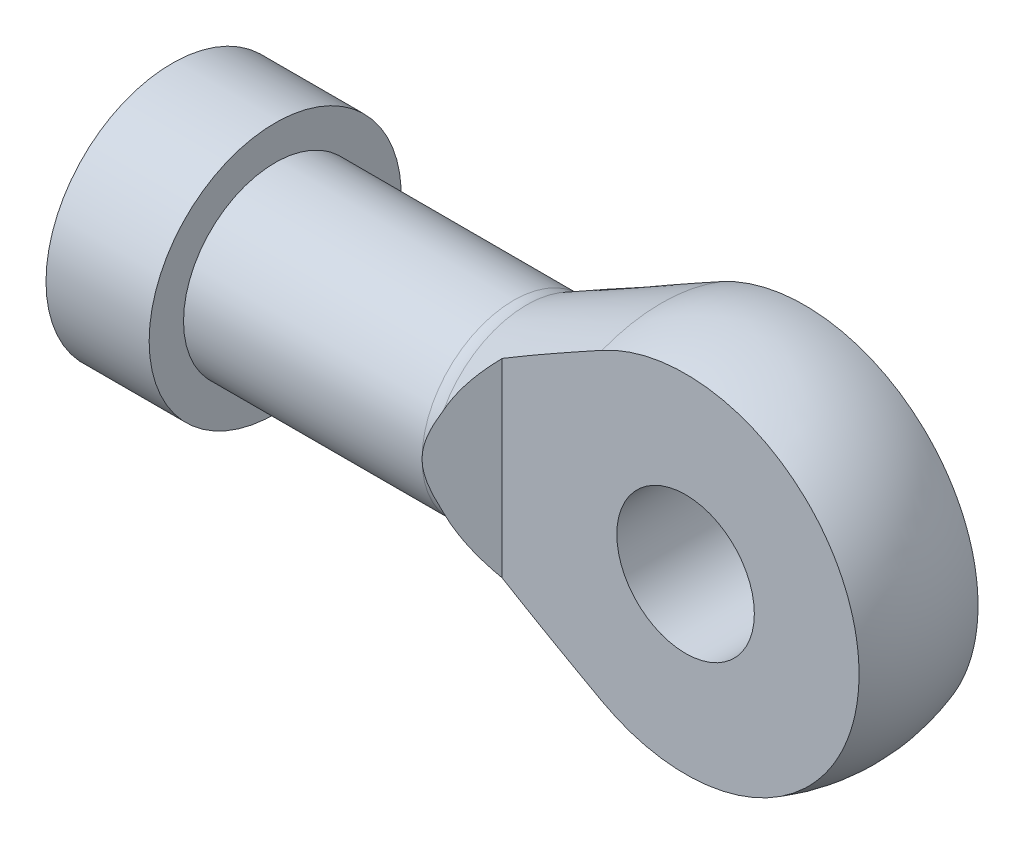
ISO-10303-21;
HEADER;
FILE_DESCRIPTION(('STEP AP214'),'2;1');
FILE_NAME('part.step','',(''),(''),'','','');
FILE_SCHEMA(('AUTOMOTIVE_DESIGN { 1 0 10303 214 1 1 1 1 }'));
ENDSEC;
DATA;
#1=APPLICATION_CONTEXT('core data for automotive mechanical design processes');
#2=APPLICATION_PROTOCOL_DEFINITION('international standard','automotive_design',2000,#1);
#3=PRODUCT_CONTEXT('',#1,'mechanical');
#4=PRODUCT('Part','Part','',(#3));
#5=PRODUCT_RELATED_PRODUCT_CATEGORY('part','',(#4));
#6=PRODUCT_DEFINITION_FORMATION('','',#4);
#7=PRODUCT_DEFINITION_CONTEXT('part definition',#1,'design');
#8=PRODUCT_DEFINITION('design','',#6,#7);
#9=PRODUCT_DEFINITION_SHAPE('','',#8);
#10=(LENGTH_UNIT() NAMED_UNIT(*) SI_UNIT(.MILLI.,.METRE.));
#11=(NAMED_UNIT(*) PLANE_ANGLE_UNIT() SI_UNIT($,.RADIAN.));
#12=(NAMED_UNIT(*) SI_UNIT($,.STERADIAN.) SOLID_ANGLE_UNIT());
#13=UNCERTAINTY_MEASURE_WITH_UNIT(LENGTH_MEASURE(1.E-05),#10,'distance_accuracy_value','');
#14=(GEOMETRIC_REPRESENTATION_CONTEXT(3) GLOBAL_UNCERTAINTY_ASSIGNED_CONTEXT((#13)) GLOBAL_UNIT_ASSIGNED_CONTEXT((#10,
#11,#12)) REPRESENTATION_CONTEXT('',''));
#15=CARTESIAN_POINT('',(0.,0.,0.));
#16=DIRECTION('',(0.,0.,1.));
#17=DIRECTION('',(1.,0.,0.));
#18=AXIS2_PLACEMENT_3D('',#15,#16,#17);
#19=CARTESIAN_POINT('',(29.8113288265605,0.,0.));
#20=DIRECTION('',(-1.,0.,0.));
#21=DIRECTION('',(0.,0.,1.));
#22=AXIS2_PLACEMENT_3D('',#19,#20,#21);
#23=TOROIDAL_SURFACE('',#22,11.,3.00000000000001);
#24=CARTESIAN_POINT('',(30.9450198188403,0.,0.));
#25=DIRECTION('',(-1.,0.,0.));
#26=DIRECTION('',(0.,0.,1.));
#27=AXIS2_PLACEMENT_3D('',#24,#25,#26);
#28=CIRCLE('',#27,8.22245706891441);
#29=CARTESIAN_POINT('',(30.9450198188403,-3.89794287599453,-7.23980949926338));
#30=VERTEX_POINT('',#29);
#31=CARTESIAN_POINT('',(30.9450198188403,-3.89794287599452,7.23980949926338));
#32=VERTEX_POINT('',#31);
#33=EDGE_CURVE('E107',#30,#32,#28,.T.);
#34=ORIENTED_EDGE('',*,*,#33,.T.);
#35=CARTESIAN_POINT('',(31.4200923023846,-4.87856840032541,6.92125215726189));
#36=CARTESIAN_POINT('',(31.3622381525221,-4.75973716513387,6.96004595156132));
#37=CARTESIAN_POINT('',(31.3042285169096,-4.64102024515908,6.99894400600842));
#38=CARTESIAN_POINT('',(31.188398467383,-4.40343351652677,7.07661323329303));
#39=CARTESIAN_POINT('',(31.1305780773517,-4.28456369102397,7.11538439011621));
#40=CARTESIAN_POINT('',(30.9576629752365,-3.92613951363799,7.23133169758978));
#41=CARTESIAN_POINT('',(30.8436363813072,-3.68581767193226,7.30779162725905));
#42=CARTESIAN_POINT('',(30.6752574445568,-3.31507828822572,7.42069723303123));
#43=CARTESIAN_POINT('',(30.6181957013521,-3.18645629320427,7.45895968323594));
#44=CARTESIAN_POINT('',(30.5069818463368,-2.92740774182072,7.53353354569818));
#45=CARTESIAN_POINT('',(30.4528294309702,-2.79698137551731,7.5698451615035));
#46=CARTESIAN_POINT('',(30.3484649789267,-2.53410673966539,7.63982619301766));
#47=CARTESIAN_POINT('',(30.2982466561449,-2.40166211700807,7.67349982384089));
#48=CARTESIAN_POINT('',(30.2028076412612,-2.13420399310744,7.73749595065876));
#49=CARTESIAN_POINT('',(30.1575857583364,-1.99919111299867,7.76781924515345));
#50=CARTESIAN_POINT('',(30.069161330283,-1.71225326072776,7.82711177786033));
#51=CARTESIAN_POINT('',(30.0266447038383,-1.5600169352831,7.85562107692574));
#52=CARTESIAN_POINT('',(29.9514538350786,-1.25198444303337,7.90603991641768));
#53=CARTESIAN_POINT('',(29.9187801018195,-1.09618809255871,7.92794911549957));
#54=CARTESIAN_POINT('',(29.8659897164095,-0.78445054146163,7.96334742931893));
#55=CARTESIAN_POINT('',(29.8456538867856,-0.628564333635189,7.97698351235207));
#56=CARTESIAN_POINT('',(29.818329117447,-0.315110508880718,7.99530599195853));
#57=CARTESIAN_POINT('',(29.8113347246053,-0.157543605407018,7.99999604509726));
#58=CARTESIAN_POINT('',(29.8113241048138,0.126123322182381,8.0000031661423));
#59=CARTESIAN_POINT('',(29.8157982987793,0.252231712669175,7.99700301903501));
#60=CARTESIAN_POINT('',(29.8334083848498,0.503570296749024,7.9851946689298));
#61=CARTESIAN_POINT('',(29.8465449775593,0.628800418480719,7.97638599614523));
#62=CARTESIAN_POINT('',(29.8810168524398,0.879635772892231,7.95327106270642));
#63=CARTESIAN_POINT('',(29.9024792666218,1.00521526685343,7.93887955435435));
#64=CARTESIAN_POINT('',(29.9525165460667,1.25423867646256,7.90532732118349));
#65=CARTESIAN_POINT('',(29.9810896987859,1.37768309867428,7.88616774470174));
#66=CARTESIAN_POINT('',(30.052542205341,1.65456490358828,7.83825564422029));
#67=CARTESIAN_POINT('',(30.0972072367431,1.807329388833,7.80830574356995));
#68=CARTESIAN_POINT('',(30.1939831027027,2.10942759332558,7.74341319833142));
#69=CARTESIAN_POINT('',(30.2460976597224,2.25875955380515,7.7084680576659));
#70=CARTESIAN_POINT('',(30.3561651512017,2.55487760493418,7.63466288321161));
#71=CARTESIAN_POINT('',(30.4141381659785,2.7016527686333,7.59578938467235));
#72=CARTESIAN_POINT('',(30.534283842228,2.99263544136374,7.51522633670648));
#73=CARTESIAN_POINT('',(30.5964557776491,3.13684338888097,7.47353727413003));
#74=CARTESIAN_POINT('',(30.7205386570791,3.41597402477362,7.39033415538865));
#75=CARTESIAN_POINT('',(30.7822998131962,3.55099393264792,7.34892053870254));
#76=CARTESIAN_POINT('',(30.9076509031833,3.8198036362939,7.26486702807744));
#77=CARTESIAN_POINT('',(30.9712409671649,3.95359334364897,7.22222704689278));
#78=CARTESIAN_POINT('',(31.0989323494273,4.21934244747333,7.13660426565626));
#79=CARTESIAN_POINT('',(31.1630251149859,4.3513078363054,7.09362720058701));
#80=CARTESIAN_POINT('',(31.2915093091828,4.61499201837562,7.00747280349967));
#81=CARTESIAN_POINT('',(31.3559006741874,4.74671085645052,6.9642955141507));
#82=CARTESIAN_POINT('',(31.4200923023846,4.87856840032541,6.92125215726189));
#83=B_SPLINE_CURVE_WITH_KNOTS('',3,(#35,#36,#37,#38,#39,#40,#41,#42,#43,#44,#45,#46,#47,#48,#49,
#50,#51,#52,#53,#54,#55,#56,#57,#58,#59,#60,#61,#62,#63,#64,#65,#66,#67,#68,#69,#70,#71,#72,#73,
#74,#75,#76,#77,#78,#79,#80,#81,#82),.UNSPECIFIED.,.F.,.F.,(4,2,2,2,2,2,2,2,2,2,2,2,2,2,2,2,2,2,
2,2,2,2,2,4),(0.,0.413218881997825,0.826488042846023,1.65669060467526,2.09411324786009,
2.5314901618836,2.96815331888869,3.40471217856495,3.88616599492559,4.36764470689011,
4.84029858427634,5.31275922952541,5.69099296376868,6.06925729286005,6.45354059026506,
6.83773142665747,7.32321151111738,7.80893503925595,8.29638384976407,8.78374858833443,
9.24614663374058,9.70857765671311,10.1671916162889,10.6257119635913),.UNSPECIFIED.);
#84=CARTESIAN_POINT('',(29.8113288265605,0.,8.));
#85=VERTEX_POINT('',#84);
#86=EDGE_CURVE('E94',#32,#85,#83,.T.);
#87=ORIENTED_EDGE('',*,*,#86,.T.);
#88=CARTESIAN_POINT('',(29.8113288265605,0.,0.));
#89=DIRECTION('',(-1.,0.,0.));
#90=DIRECTION('',(0.,0.,1.));
#91=AXIS2_PLACEMENT_3D('',#88,#89,#90);
#92=CIRCLE('',#91,8.00000000000001);
#93=CARTESIAN_POINT('',(29.8113288265605,0.,-8.00000000000001));
#94=VERTEX_POINT('',#93);
#95=EDGE_CURVE('E105',#94,#85,#92,.T.);
#96=ORIENTED_EDGE('',*,*,#95,.F.);
#97=CARTESIAN_POINT('',(31.4200923023846,-4.8785684003254,-6.92125215726189));
#98=CARTESIAN_POINT('',(31.3622381525221,-4.75973716513386,-6.96004595156133));
#99=CARTESIAN_POINT('',(31.3042285169096,-4.64102024515907,-6.99894400600842));
#100=CARTESIAN_POINT('',(31.188398467383,-4.40343351652676,-7.07661323329304));
#101=CARTESIAN_POINT('',(31.1305780773517,-4.28456369102395,-7.11538439011622));
#102=CARTESIAN_POINT('',(30.9576629752365,-3.92613951363798,-7.23133169758978));
#103=CARTESIAN_POINT('',(30.8436363813072,-3.68581767193225,-7.30779162725905));
#104=CARTESIAN_POINT('',(30.6752574445568,-3.31507828822571,-7.42069723303123));
#105=CARTESIAN_POINT('',(30.6181957013521,-3.18645629320426,-7.45895968323594));
#106=CARTESIAN_POINT('',(30.5069818463368,-2.92740774182072,-7.53353354569818));
#107=CARTESIAN_POINT('',(30.4528294309702,-2.7969813755173,-7.5698451615035));
#108=CARTESIAN_POINT('',(30.3484649789267,-2.53410673966538,-7.63982619301766));
#109=CARTESIAN_POINT('',(30.2982466561449,-2.40166211700806,-7.67349982384089));
#110=CARTESIAN_POINT('',(30.2028076412612,-2.13420399310744,-7.73749595065876));
#111=CARTESIAN_POINT('',(30.1575857583364,-1.99919111299867,-7.76781924515345));
#112=CARTESIAN_POINT('',(30.069161330283,-1.71225326072775,-7.82711177786033));
#113=CARTESIAN_POINT('',(30.0266447038383,-1.5600169352831,-7.85562107692574));
#114=CARTESIAN_POINT('',(29.9514538350786,-1.25198444303336,-7.90603991641768));
#115=CARTESIAN_POINT('',(29.9187801018195,-1.0961880925587,-7.92794911549957));
#116=CARTESIAN_POINT('',(29.8659897164095,-0.784450541461629,-7.96334742931893));
#117=CARTESIAN_POINT('',(29.8456538867856,-0.628564333635189,-7.97698351235207));
#118=CARTESIAN_POINT('',(29.818329117447,-0.315110508880719,-7.99530599195853));
#119=CARTESIAN_POINT('',(29.8113347246053,-0.157543605407019,-7.99999604509726));
#120=CARTESIAN_POINT('',(29.8113241048138,0.126123322182381,-8.0000031661423));
#121=CARTESIAN_POINT('',(29.8157982987793,0.252231712669174,-7.99700301903501));
#122=CARTESIAN_POINT('',(29.8334083848498,0.503570296749024,-7.9851946689298));
#123=CARTESIAN_POINT('',(29.8465449775593,0.62880041848072,-7.97638599614523));
#124=CARTESIAN_POINT('',(29.8810168524398,0.879635772892231,-7.95327106270642));
#125=CARTESIAN_POINT('',(29.9024792666218,1.00521526685343,-7.93887955435435));
#126=CARTESIAN_POINT('',(29.9525165460667,1.25423867646256,-7.90532732118349));
#127=CARTESIAN_POINT('',(29.9810896987859,1.37768309867428,-7.88616774470174));
#128=CARTESIAN_POINT('',(30.052542205341,1.65456490358828,-7.83825564422029));
#129=CARTESIAN_POINT('',(30.0972072367431,1.807329388833,-7.80830574356995));
#130=CARTESIAN_POINT('',(30.1939831027027,2.10942759332558,-7.74341319833142));
#131=CARTESIAN_POINT('',(30.2460976597224,2.25875955380515,-7.7084680576659));
#132=CARTESIAN_POINT('',(30.3561651512017,2.55487760493417,-7.63466288321161));
#133=CARTESIAN_POINT('',(30.4141381659784,2.7016527686333,-7.59578938467235));
#134=CARTESIAN_POINT('',(30.534283842228,2.99263544136373,-7.51522633670648));
#135=CARTESIAN_POINT('',(30.5964557776491,3.13684338888096,-7.47353727413003));
#136=CARTESIAN_POINT('',(30.7205386570791,3.41597402477361,-7.39033415538865));
#137=CARTESIAN_POINT('',(30.7822998131962,3.55099393264792,-7.34892053870254));
#138=CARTESIAN_POINT('',(30.9076509031833,3.81980363629389,-7.26486702807745));
#139=CARTESIAN_POINT('',(30.9712409671649,3.95359334364896,-7.22222704689278));
#140=CARTESIAN_POINT('',(31.0989323494273,4.21934244747332,-7.13660426565626));
#141=CARTESIAN_POINT('',(31.1630251149859,4.35130783630539,-7.09362720058701));
#142=CARTESIAN_POINT('',(31.2915093091828,4.61499201837561,-7.00747280349967));
#143=CARTESIAN_POINT('',(31.3559006741874,4.74671085645051,-6.9642955141507));
#144=CARTESIAN_POINT('',(31.4200923023846,4.8785684003254,-6.92125215726189));
#145=B_SPLINE_CURVE_WITH_KNOTS('',3,(#97,#98,#99,#100,#101,#102,#103,#104,#105,#106,#107,#108,
#109,#110,#111,#112,#113,#114,#115,#116,#117,#118,#119,#120,#121,#122,#123,#124,#125,#126,#127,
#128,#129,#130,#131,#132,#133,#134,#135,#136,#137,#138,#139,#140,#141,#142,#143,#144),
.UNSPECIFIED.,.F.,.F.,(4,2,2,2,2,2,2,2,2,2,2,2,2,2,2,2,2,2,2,2,2,2,2,4),(0.,0.413218881997826,
0.826488042846022,1.65669060467526,2.09411324786009,2.5314901618836,2.96815331888868,
3.40471217856494,3.88616599492558,4.36764470689009,4.84029858427633,5.3127592295254,
5.69099296376867,6.06925729286004,6.45354059026505,6.83773142665745,7.32321151111737,
7.80893503925594,8.29638384976406,8.78374858833441,9.24614663374056,9.70857765671309,
10.1671916162889,10.6257119635912),.UNSPECIFIED.);
#146=EDGE_CURVE('E212',#30,#94,#145,.T.);
#147=ORIENTED_EDGE('',*,*,#146,.F.);
#148=EDGE_LOOP('',(#34,#87,#96,#147));
#149=FACE_BOUND('',#148,.T.);
#150=ADVANCED_FACE('F32',(#149),#23,.F.);
#151=CARTESIAN_POINT('',(50.,0.,0.));
#152=DIRECTION('',(-1.,0.,0.));
#153=DIRECTION('',(0.,0.,1.));
#154=AXIS2_PLACEMENT_3D('',#151,#152,#153);
#155=SPHERICAL_SURFACE('',#154,16.);
#156=CARTESIAN_POINT('',(50.,0.,5.19130869130869));
#157=DIRECTION('',(0.,0.,1.));
#158=DIRECTION('',(1.,0.,0.));
#159=AXIS2_PLACEMENT_3D('',#156,#157,#158);
#160=CIRCLE('',#159,15.1344082828349);
#161=CARTESIAN_POINT('',(42.711427769454,-13.2637486749281,5.19130869130869));
#162=VERTEX_POINT('',#161);
#163=CARTESIAN_POINT('',(42.711427769454,13.2637486749281,5.19130869130869));
#164=VERTEX_POINT('',#163);
#165=EDGE_CURVE('E164',#162,#164,#160,.T.);
#166=ORIENTED_EDGE('',*,*,#165,.F.);
#167=CARTESIAN_POINT('',(42.711427769454,0.,0.));
#168=DIRECTION('',(-1.,0.,0.));
#169=DIRECTION('',(0.,0.,1.));
#170=AXIS2_PLACEMENT_3D('',#167,#168,#169);
#171=CIRCLE('',#170,14.2434797307439);
#172=CARTESIAN_POINT('',(42.711427769454,-13.2637486749281,-5.19130869130869));
#173=VERTEX_POINT('',#172);
#174=EDGE_CURVE('E122',#173,#162,#171,.T.);
#175=ORIENTED_EDGE('',*,*,#174,.F.);
#176=CARTESIAN_POINT('',(50.,0.,-5.19130869130869));
#177=DIRECTION('',(0.,0.,1.));
#178=DIRECTION('',(1.,0.,0.));
#179=AXIS2_PLACEMENT_3D('',#176,#177,#178);
#180=CIRCLE('',#179,15.1344082828349);
#181=CARTESIAN_POINT('',(42.711427769454,13.2637486749281,-5.19130869130869));
#182=VERTEX_POINT('',#181);
#183=EDGE_CURVE('E214',#173,#182,#180,.T.);
#184=ORIENTED_EDGE('',*,*,#183,.T.);
#185=EDGE_CURVE('E121',#164,#182,#171,.T.);
#186=ORIENTED_EDGE('',*,*,#185,.F.);
#187=EDGE_LOOP('',(#166,#175,#184,#186));
#188=FACE_BOUND('',#187,.T.);
#189=ADVANCED_FACE('F34',(#188),#155,.T.);
#190=CARTESIAN_POINT('',(42.711427769454,0.,0.));
#191=DIRECTION('',(1.,0.,0.));
#192=DIRECTION('',(0.,0.,-1.));
#193=AXIS2_PLACEMENT_3D('',#190,#191,#192);
#194=CONICAL_SURFACE('',#193,14.2434797307439,0.472973956936773);
#195=CARTESIAN_POINT('',(30.9450198188403,3.89794287599449,7.23980949926338));
#196=VERTEX_POINT('',#195);
#197=CARTESIAN_POINT('',(30.9450198188403,3.89794287599453,-7.23980949926338));
#198=VERTEX_POINT('',#197);
#199=EDGE_CURVE('E116',#196,#198,#28,.T.);
#200=ORIENTED_EDGE('',*,*,#199,.F.);
#201=CARTESIAN_POINT('',(79.2044041840257,0.,-25.1202655261501));
#202=DIRECTION('',(-0.556928094519513,0.,-0.830560712732588));
#203=DIRECTION('',(0.830560712732588,0.,-0.556928094519513));
#204=AXIS2_PLACEMENT_3D('',#201,#202,#203);
#205=ELLIPSE('',#204,59.1053075226285,21.2727030970992);
#206=CARTESIAN_POINT('',(34.,8.29522887808102,5.19130869130869));
#207=VERTEX_POINT('',#206);
#208=EDGE_CURVE('E97',#196,#207,#205,.T.);
#209=ORIENTED_EDGE('',*,*,#208,.T.);
#210=CARTESIAN_POINT('',(63.8617265448978,-24.522902231138,5.19130869130869));
#211=CARTESIAN_POINT('',(62.6206877352105,-23.8737277777065,5.19130869130869));
#212=CARTESIAN_POINT('',(61.3800665335309,-23.2237519454734,5.19130869130869));
#213=CARTESIAN_POINT('',(58.8999646547902,-21.9215477236551,5.19130869130869));
#214=CARTESIAN_POINT('',(57.6604840092269,-21.2693192740934,5.19130869130869));
#215=CARTESIAN_POINT('',(55.1811760181686,-19.9610137229548,5.19130869130869));
#216=CARTESIAN_POINT('',(53.941350944413,-19.3049323142552,5.19130869130869));
#217=CARTESIAN_POINT('',(51.4637777343693,-17.988921408181,5.19130869130869));
#218=CARTESIAN_POINT('',(50.2260295524387,-17.3289919968363,5.19130869130869));
#219=CARTESIAN_POINT('',(48.3418763565556,-16.3191488011364,5.19130869130869));
#220=CARTESIAN_POINT('',(47.6944256886982,-15.9711861398999,5.19130869130869));
#221=CARTESIAN_POINT('',(46.4004924603043,-15.2734659431645,5.19130869130869));
#222=CARTESIAN_POINT('',(45.7540098989102,-14.9237084092567,5.19130869130869));
#223=CARTESIAN_POINT('',(44.4621883218923,-14.2219759349579,5.19130869130869));
#224=CARTESIAN_POINT('',(43.8168493920631,-13.8700008365376,5.19130869130869));
#225=CARTESIAN_POINT('',(42.5276656715761,-13.1633281097556,5.19130869130869));
#226=CARTESIAN_POINT('',(41.8838208759006,-12.8086304905541,5.19130869130869));
#227=CARTESIAN_POINT('',(40.5986755686717,-12.0961465083085,5.19130869130869));
#228=CARTESIAN_POINT('',(39.9573731661771,-11.7383635601275,5.19130869130869));
#229=CARTESIAN_POINT('',(38.6772664021473,-11.0183612805604,5.19130869130869));
#230=CARTESIAN_POINT('',(38.0384620250529,-10.6561419768649,5.19130869130869));
#231=CARTESIAN_POINT('',(36.7642793595163,-9.92587636125776,5.19130869130869));
#232=CARTESIAN_POINT('',(36.1289006837578,-9.55783072742279,5.19130869130869));
#233=CARTESIAN_POINT('',(35.1793956565603,-8.99972005670107,5.19130869130869));
#234=CARTESIAN_POINT('',(34.8634920504191,-8.81267869435025,5.19130869130869));
#235=CARTESIAN_POINT('',(34.2331248856106,-8.43618645271673,5.19130869130869));
#236=CARTESIAN_POINT('',(33.918661317262,-8.24673558966525,5.19130869130869));
#237=CARTESIAN_POINT('',(33.3144104077689,-7.87889110931233,5.19130869130869));
#238=CARTESIAN_POINT('',(33.024499168304,-7.70070121759139,5.19130869130869));
#239=CARTESIAN_POINT('',(32.4465228949154,-7.34133133817037,5.19130869130869));
#240=CARTESIAN_POINT('',(32.1584579079807,-7.16015127478342,5.19130869130869));
#241=CARTESIAN_POINT('',(31.5842846563196,-6.79393510017861,5.19130869130869));
#242=CARTESIAN_POINT('',(31.2981792447018,-6.60889450666874,5.19130869130869));
#243=CARTESIAN_POINT('',(30.7289346481657,-6.23432773145815,5.19130869130869));
#244=CARTESIAN_POINT('',(30.4457953054043,-6.04480179021814,5.19130869130869));
#245=CARTESIAN_POINT('',(29.8843352679934,-5.66075753547685,5.19130869130869));
#246=CARTESIAN_POINT('',(29.6060013478022,-5.46625863840056,5.19130869130869));
#247=CARTESIAN_POINT('',(29.0545207315878,-5.07007064294381,5.19130869130869));
#248=CARTESIAN_POINT('',(28.7813735521174,-4.86838221977901,5.19130869130869));
#249=CARTESIAN_POINT('',(28.2427315356481,-4.45588506748978,5.19130869130869));
#250=CARTESIAN_POINT('',(27.9772240367499,-4.24509307346316,5.19130869130869));
#251=CARTESIAN_POINT('',(27.5870291509413,-3.91934971899777,5.19130869130869));
#252=CARTESIAN_POINT('',(27.4583340504197,-3.80919951790973,5.19130869130869));
#253=CARTESIAN_POINT('',(27.2042908512933,-3.58511351974915,5.19130869130869));
#254=CARTESIAN_POINT('',(27.0789423335305,-3.47117820081083,5.19130869130869));
#255=CARTESIAN_POINT('',(26.886087909831,-3.28936024319209,5.19130869130869));
#256=CARTESIAN_POINT('',(26.8171409699853,-3.22300558018811,5.19130869130869));
#257=CARTESIAN_POINT('',(26.6808120585693,-3.08870847574196,5.19130869130869));
#258=CARTESIAN_POINT('',(26.6134301020116,-3.02076601908084,5.19130869130869));
#259=CARTESIAN_POINT('',(26.4139025894722,-2.81422303675963,5.19130869130869));
#260=CARTESIAN_POINT('',(26.2844523942005,-2.67297865752662,5.19130869130869));
#261=CARTESIAN_POINT('',(26.0361809052965,-2.38275669158616,5.19130869130869));
#262=CARTESIAN_POINT('',(25.9173028908034,-2.23382812263812,5.19130869130869));
#263=CARTESIAN_POINT('',(25.6935241527388,-1.92591163294284,5.19130869130869));
#264=CARTESIAN_POINT('',(25.5886048224167,-1.76693752855544,5.19130869130869));
#265=CARTESIAN_POINT('',(25.4068863646291,-1.45161255612259,5.19130869130869));
#266=CARTESIAN_POINT('',(25.3284378114154,-1.29622942332324,5.19130869130869));
#267=CARTESIAN_POINT('',(25.1945611571315,-0.975557440943524,5.19130869130869));
#268=CARTESIAN_POINT('',(25.1391144371712,-0.810276727497845,5.19130869130869));
#269=CARTESIAN_POINT('',(25.0781313412227,-0.555917256233411,5.19130869130869));
#270=CARTESIAN_POINT('',(25.0614659423704,-0.469451475875564,5.19130869130869));
#271=CARTESIAN_POINT('',(25.0364726454,-0.295301181358434,5.19130869130869));
#272=CARTESIAN_POINT('',(25.0281441809711,-0.207616750389879,5.19130869130869));
#273=CARTESIAN_POINT('',(25.0202270922709,-0.0319013161632051,5.19130869130869));
#274=CARTESIAN_POINT('',(25.0206332859394,0.0561294506265643,5.19130869130869));
#275=CARTESIAN_POINT('',(25.0301347513235,0.231698245532667,5.19130869130869));
#276=CARTESIAN_POINT('',(25.0392297907091,0.319236286760976,5.19130869130869));
#277=CARTESIAN_POINT('',(25.0755374089168,0.557257410673761,5.19130869130869));
#278=CARTESIAN_POINT('',(25.1111682263207,0.706501985988064,5.19130869130869));
#279=CARTESIAN_POINT('',(25.2034658158981,0.998183050179986,5.19130869130869));
#280=CARTESIAN_POINT('',(25.260148555588,1.14061427844969,5.19130869130869));
#281=CARTESIAN_POINT('',(25.3847681874181,1.40715716177502,5.19130869130869));
#282=CARTESIAN_POINT('',(25.4515158182565,1.53183731014884,5.19130869130869));
#283=CARTESIAN_POINT('',(25.5956751874995,1.77493181498953,5.19130869130869));
#284=CARTESIAN_POINT('',(25.6730962388398,1.89334057317543,5.19130869130869));
#285=CARTESIAN_POINT('',(25.8363518861587,2.12482435651685,5.19130869130869));
#286=CARTESIAN_POINT('',(25.9222176137301,2.23787718191119,5.19130869130869));
#287=CARTESIAN_POINT('',(26.100192160708,2.45883959099717,5.19130869130869));
#288=CARTESIAN_POINT('',(26.1922984093938,2.56675126170908,5.19130869130869));
#289=CARTESIAN_POINT('',(26.3706658713229,2.76616319135612,5.19130869130869));
#290=CARTESIAN_POINT('',(26.4564030287408,2.85813550016952,5.19130869130869));
#291=CARTESIAN_POINT('',(26.6310203324117,3.03905380264459,5.19130869130869));
#292=CARTESIAN_POINT('',(26.719900823532,3.12799946212721,5.19130869130869));
#293=CARTESIAN_POINT('',(26.9904903460608,3.39096602073621,5.19130869130869));
#294=CARTESIAN_POINT('',(27.1760571788305,3.56101788441526,5.19130869130869));
#295=CARTESIAN_POINT('',(27.5547403934977,3.89326979624728,5.19130869130869));
#296=CARTESIAN_POINT('',(27.7478728071021,4.05545133662068,5.19130869130869));
#297=CARTESIAN_POINT('',(28.1394157352944,4.3733392242908,5.19130869130869));
#298=CARTESIAN_POINT('',(28.3378269372484,4.52904472149015,5.19130869130869));
#299=CARTESIAN_POINT('',(28.7397529035954,4.83612632359942,5.19130869130869));
#300=CARTESIAN_POINT('',(28.9432903610907,4.98747258628694,5.19130869130869));
#301=CARTESIAN_POINT('',(29.3534809577922,5.28589652814507,5.19130869130869));
#302=CARTESIAN_POINT('',(29.5601342887782,5.43297394292799,5.19130869130869));
#303=CARTESIAN_POINT('',(29.9755758516073,5.72337585900041,5.19130869130869));
#304=CARTESIAN_POINT('',(30.1843602509765,5.86670585586092,5.19130869130869));
#305=CARTESIAN_POINT('',(30.6039069427302,6.15042038800451,5.19130869130869));
#306=CARTESIAN_POINT('',(30.814669172226,6.29080501648481,5.19130869130869));
#307=CARTESIAN_POINT('',(31.4431428496069,6.70415038141865,5.19130869130869));
#308=CARTESIAN_POINT('',(31.8631926277939,6.97355543928402,5.19130869130869));
#309=CARTESIAN_POINT('',(32.7077314718715,7.50532906276514,5.19130869130869));
#310=CARTESIAN_POINT('',(33.1322207921848,7.76769722200287,5.19130869130869));
#311=CARTESIAN_POINT('',(33.984550063063,8.28710058074319,5.19130869130869));
#312=CARTESIAN_POINT('',(34.412390609659,8.5441348004857,5.19130869130869));
#313=CARTESIAN_POINT('',(35.2705677340408,9.05400396696253,5.19130869130869));
#314=CARTESIAN_POINT('',(35.7009043387564,9.3068388682764,5.19130869130869));
#315=CARTESIAN_POINT('',(36.5640062441011,9.80943924602385,5.19130869130869));
#316=CARTESIAN_POINT('',(36.9967737167805,10.0592009880436,5.19130869130869));
#317=CARTESIAN_POINT('',(37.8638714068391,10.5559985680174,5.19130869130869));
#318=CARTESIAN_POINT('',(38.2982016317291,10.8030343928473,5.19130869130869));
#319=CARTESIAN_POINT('',(39.6029809522579,11.5407473127761,5.19130869130869));
#320=CARTESIAN_POINT('',(40.4753168068836,12.0280866585041,5.19130869130869));
#321=CARTESIAN_POINT('',(42.2183546364905,12.9937253052308,5.19130869130869));
#322=CARTESIAN_POINT('',(43.0890366949987,13.4720606633655,5.19130869130869));
#323=CARTESIAN_POINT('',(44.8328944365938,14.424215799799,5.19130869130869));
#324=CARTESIAN_POINT('',(45.7060701851899,14.8980354580254,5.19130869130869));
#325=CARTESIAN_POINT('',(47.4537807101625,15.8419929596244,5.19130869130869));
#326=CARTESIAN_POINT('',(48.3283144610212,16.3121327035686,5.19130869130869));
#327=CARTESIAN_POINT('',(50.0787941694444,17.2497549752706,5.19130869130869));
#328=CARTESIAN_POINT('',(50.9547401140626,17.7172375272126,5.19130869130869));
#329=CARTESIAN_POINT('',(53.4036171499262,19.0204406898115,5.19130869130869));
#330=CARTESIAN_POINT('',(54.977777028543,19.8538516789088,5.19130869130869));
#331=CARTESIAN_POINT('',(58.1285073986841,21.516106445398,5.19130869130869));
#332=CARTESIAN_POINT('',(59.7050778951206,22.3449502134672,5.19130869130869));
#333=CARTESIAN_POINT('',(62.8599557792438,23.9993584025189,5.19130869130869));
#334=CARTESIAN_POINT('',(64.4382631821926,24.8249227943875,5.19130869130869));
#335=CARTESIAN_POINT('',(67.596149288296,26.4736167641924,5.19130869130869));
#336=CARTESIAN_POINT('',(69.1757279918596,27.2967463413449,5.19130869130869));
#337=CARTESIAN_POINT('',(72.3362790937141,28.941372058475,5.19130869130869));
#338=CARTESIAN_POINT('',(73.9172517536337,29.7628676955585,5.19130869130869));
#339=CARTESIAN_POINT('',(77.0799504322855,31.4044079229456,5.19130869130869));
#340=CARTESIAN_POINT('',(78.6616764511571,32.2244525129806,5.19130869130869));
#341=CARTESIAN_POINT('',(83.4077267772914,34.6828660722185,5.19130869130869));
#342=CARTESIAN_POINT('',(86.5729381068081,36.3195224993717,5.19130869130869));
#343=CARTESIAN_POINT('',(92.935156030789,39.6054517237376,5.19130869130869));
#344=CARTESIAN_POINT('',(96.1321775109535,41.2546956855566,5.19130869130869));
#345=CARTESIAN_POINT('',(102.527328836146,44.5510448452729,5.19130869130869));
#346=CARTESIAN_POINT('',(105.725458682829,46.1981500399581,5.19130869130869));
#347=CARTESIAN_POINT('',(112.121534159708,49.4903164281862,5.19130869130869));
#348=CARTESIAN_POINT('',(115.31947954764,51.1353780924814,5.19130869130869));
#349=CARTESIAN_POINT('',(121.715969017458,54.4243235019625,5.19130869130869));
#350=CARTESIAN_POINT('',(124.914513098299,56.0682072491814,5.19130869130869));
#351=CARTESIAN_POINT('',(128.113265128167,57.7116859482596,5.19130869130869));
#352=B_SPLINE_CURVE_WITH_KNOTS('',3,(#210,#211,#212,#213,#214,#215,#216,#217,#218,#219,#220,
#221,#222,#223,#224,#225,#226,#227,#228,#229,#230,#231,#232,#233,#234,#235,#236,#237,#238,#239,
#240,#241,#242,#243,#244,#245,#246,#247,#248,#249,#250,#251,#252,#253,#254,#255,#256,#257,#258,
#259,#260,#261,#262,#263,#264,#265,#266,#267,#268,#269,#270,#271,#272,#273,#274,#275,#276,#277,
#278,#279,#280,#281,#282,#283,#284,#285,#286,#287,#288,#289,#290,#291,#292,#293,#294,#295,#296,
#297,#298,#299,#300,#301,#302,#303,#304,#305,#306,#307,#308,#309,#310,#311,#312,#313,#314,#315,
#316,#317,#318,#319,#320,#321,#322,#323,#324,#325,#326,#327,#328,#329,#330,#331,#332,#333,#334,
#335,#336,#337,#338,#339,#340,#341,#342,#343,#344,#345,#346,#347,#348,#349,#350,#351),
.UNSPECIFIED.,.F.,.F.,(4,2,2,2,2,2,2,2,2,2,2,2,2,2,2,2,2,2,2,2,2,2,2,2,2,2,2,2,2,2,2,2,2,2,2,2,
2,2,2,2,2,2,2,2,2,2,2,2,2,2,2,2,2,2,2,2,2,2,2,2,2,2,2,2,2,2,2,2,2,2,4),(0.,4.20172094492939,
8.40355463778615,12.6116947660923,16.8197411708483,19.0248316010459,21.2299200767911,
23.4351675114124,25.6404075294739,27.8434589120421,30.046496550688,32.2492796545584,
33.3506414850742,34.4519959003619,35.4728639009833,36.4937577814461,37.5159113916518,
38.5380103275033,39.556593260835,40.5750807830862,41.5917696956805,42.0999065813917,
42.6079795217557,42.8950265569494,43.1820763446066,43.7564913542771,44.3276107271569,
44.8979610099521,45.4188578307801,45.9393321837932,46.2031573274006,46.4669645486911,
46.7306152638925,46.9942589295661,47.4525308045633,47.9111509830285,48.334765075797,
48.7587511541123,49.1843634520718,49.6098014769088,49.986925983254,50.3640919945287,
51.118824342779,51.8752531139122,52.631780868571,53.3926339393502,54.1535340328379,
54.9132473638962,55.672936619773,57.1698863049867,58.6669222531032,60.1642307915808,
61.6615555146432,63.1605487963232,64.6595492919069,67.6572101882764,70.6374678461362,
73.6178045291444,76.59648418546,79.5751366880517,84.9186227808191,90.2621197766963,
95.6056641061107,100.949210155383,106.294203742954,111.639198319849,122.329137592981,
133.121197067434,143.913272731592,154.702051055582,165.490810713093),.UNSPECIFIED.);
#353=EDGE_CURVE('E11',#164,#207,#352,.F.);
#354=ORIENTED_EDGE('',*,*,#353,.F.);
#355=ORIENTED_EDGE('',*,*,#185,.T.);
#356=CARTESIAN_POINT('',(128.494619457922,-57.9076151230907,-5.19130869130869));
#357=CARTESIAN_POINT('',(125.673958315092,-56.4584426349242,-5.19130869130869));
#358=CARTESIAN_POINT('',(122.853461478,-55.0089501600856,-5.19130869130869));
#359=CARTESIAN_POINT('',(117.212873726264,-52.1090706388032,-5.19130869130869));
#360=CARTESIAN_POINT('',(114.392782818415,-50.6586835791439,-5.19130869130869));
#361=CARTESIAN_POINT('',(108.741075757852,-47.7505812077105,-5.19130869130869));
#362=CARTESIAN_POINT('',(105.909462049372,-46.2928611452712,-5.19130869130869));
#363=CARTESIAN_POINT('',(100.247036962519,-43.3759679728829,-5.19130869130869));
#364=CARTESIAN_POINT('',(97.4162255727117,-41.9167948851353,-5.19130869130869));
#365=CARTESIAN_POINT('',(91.4869090834909,-38.8578121935639,-5.19130869130869));
#366=CARTESIAN_POINT('',(88.3885065433724,-37.25780376983,-5.19130869130869));
#367=CARTESIAN_POINT('',(82.1933456302113,-34.0542516934672,-5.19130869130869));
#368=CARTESIAN_POINT('',(79.0965873404782,-32.4507078796358,-5.19130869130869));
#369=CARTESIAN_POINT('',(74.4603887134262,-30.0449254029328,-5.19130869130869));
#370=CARTESIAN_POINT('',(72.9199018022729,-29.2447037852142,-5.19130869130869));
#371=CARTESIAN_POINT('',(69.8398167160814,-27.6425521992119,-5.19130869130869));
#372=CARTESIAN_POINT('',(68.300218540887,-26.8406222312283,-5.19130869130869));
#373=CARTESIAN_POINT('',(65.2224363223105,-25.2346836625315,-5.19130869130869));
#374=CARTESIAN_POINT('',(63.684252084403,-24.4306754347234,-5.19130869130869));
#375=CARTESIAN_POINT('',(60.6094272849243,-22.8197146185827,-5.19130869130869));
#376=CARTESIAN_POINT('',(59.0727867217759,-22.0127620332624,-5.19130869130869));
#377=CARTESIAN_POINT('',(56.1736630646105,-20.4854260146332,-5.19130869130869));
#378=CARTESIAN_POINT('',(54.8109540660904,-19.765471527532,-5.19130869130869));
#379=CARTESIAN_POINT('',(52.0871836272477,-18.3208350232343,-5.19130869130869));
#380=CARTESIAN_POINT('',(50.7261233245596,-17.5961508581724,-5.19130869130869));
#381=CARTESIAN_POINT('',(48.6792326900095,-16.5002391813328,-5.19130869130869));
#382=CARTESIAN_POINT('',(47.9921538779198,-16.1313437608745,-5.19130869130869));
#383=CARTESIAN_POINT('',(46.6190570767014,-15.3915845108034,-5.19130869130869));
#384=CARTESIAN_POINT('',(45.9330390864948,-15.0207206831923,-5.19130869130869));
#385=CARTESIAN_POINT('',(44.5634302955428,-14.2771657346771,-5.19130869130869));
#386=CARTESIAN_POINT('',(43.879837363497,-13.9044785419677,-5.19130869130869));
#387=CARTESIAN_POINT('',(42.5143530100495,-13.1560784617263,-5.19130869130869));
#388=CARTESIAN_POINT('',(41.8324615049933,-12.7803657269508,-5.19130869130869));
#389=CARTESIAN_POINT('',(40.4955760601299,-12.0387579074801,-5.19130869130869));
#390=CARTESIAN_POINT('',(39.8405049738556,-11.6730020658852,-5.19130869130869));
#391=CARTESIAN_POINT('',(38.5328950759154,-10.9367048576256,-5.19130869130869));
#392=CARTESIAN_POINT('',(37.880356756249,-10.5661626162987,-5.19130869130869));
#393=CARTESIAN_POINT('',(36.5748746865653,-9.81648843583184,-5.19130869130869));
#394=CARTESIAN_POINT('',(35.9219531498599,-9.43731767109541,-5.19130869130869));
#395=CARTESIAN_POINT('',(34.9467020524717,-8.86203687325029,-5.19130869130869));
#396=CARTESIAN_POINT('',(34.6224109993556,-8.6692525065325,-5.19130869130869));
#397=CARTESIAN_POINT('',(33.9754308622231,-8.28101628775528,-5.19130869130869));
#398=CARTESIAN_POINT('',(33.6527417656071,-8.08556445672114,-5.19130869130869));
#399=CARTESIAN_POINT('',(33.0164349972768,-7.69577735819472,-5.19130869130869));
#400=CARTESIAN_POINT('',(32.7027742286139,-7.50151255158623,-5.19130869130869));
#401=CARTESIAN_POINT('',(32.0778277339075,-7.10919933232437,-5.19130869130869));
#402=CARTESIAN_POINT('',(31.7665419889435,-6.91115094985663,-5.19130869130869));
#403=CARTESIAN_POINT('',(31.1462001766265,-6.5098239799075,-5.19130869130869));
#404=CARTESIAN_POINT('',(30.8371520075409,-6.30653313617792,-5.19130869130869));
#405=CARTESIAN_POINT('',(30.3766439338178,-5.99710166559933,-5.19130869130869));
#406=CARTESIAN_POINT('',(30.2236669641837,-5.89321917035547,-5.19130869130869));
#407=CARTESIAN_POINT('',(29.9188821856747,-5.68372124048885,-5.19130869130869));
#408=CARTESIAN_POINT('',(29.7670745049615,-5.57810561976673,-5.19130869130869));
#409=CARTESIAN_POINT('',(29.3169932210553,-5.26064363516156,-5.19130869130869));
#410=CARTESIAN_POINT('',(29.0207078903588,-5.04594348210789,-5.19130869130869));
#411=CARTESIAN_POINT('',(28.5820555937814,-4.71625689194326,-5.19130869130869));
#412=CARTESIAN_POINT('',(28.4368100782951,-4.60509614651341,-5.19130869130869));
#413=CARTESIAN_POINT('',(28.1486677749651,-4.37977597790938,-5.19130869130869));
#414=CARTESIAN_POINT('',(28.0057708698613,-4.26561670518808,-5.19130869130869));
#415=CARTESIAN_POINT('',(27.7234101842055,-4.03420960716921,-5.19130869130869));
#416=CARTESIAN_POINT('',(27.5839353083714,-3.91697535785434,-5.19130869130869));
#417=CARTESIAN_POINT('',(27.3086013455919,-3.67834820614443,-5.19130869130869));
#418=CARTESIAN_POINT('',(27.1727418280318,-3.55695580299001,-5.19130869130869));
#419=CARTESIAN_POINT('',(26.9058058483052,-3.30932550083592,-5.19130869130869));
#420=CARTESIAN_POINT('',(26.7747237294956,-3.18309372120606,-5.19130869130869));
#421=CARTESIAN_POINT('',(26.5186280938113,-2.92464206560749,-5.19130869130869));
#422=CARTESIAN_POINT('',(26.3936121721736,-2.79242460333413,-5.19130869130869));
#423=CARTESIAN_POINT('',(26.2441780571504,-2.62456227565987,-5.19130869130869));
#424=CARTESIAN_POINT('',(26.2158967905464,-2.59233675298741,-5.19130869130869));
#425=CARTESIAN_POINT('',(26.1598214986553,-2.52745662656002,-5.19130869130869));
#426=CARTESIAN_POINT('',(26.1320275395331,-2.49480196557531,-5.19130869130869));
#427=CARTESIAN_POINT('',(26.0494229586297,-2.39615535601574,-5.19130869130869));
#428=CARTESIAN_POINT('',(25.9954038750016,-2.32949671806981,-5.19130869130869));
#429=CARTESIAN_POINT('',(25.8897951157878,-2.1942032752615,-5.19130869130869));
#430=CARTESIAN_POINT('',(25.8382070671004,-2.125567195197,-5.19130869130869));
#431=CARTESIAN_POINT('',(25.737936812673,-1.98621274288258,-5.19130869130869));
#432=CARTESIAN_POINT('',(25.6892544780708,-1.91549446318175,-5.19130869130869));
#433=CARTESIAN_POINT('',(25.5497744289028,-1.70224382215952,-5.19130869130869));
#434=CARTESIAN_POINT('',(25.4638267548164,-1.55646166899539,-5.19130869130869));
#435=CARTESIAN_POINT('',(25.3101585990411,-1.25557438486288,-5.19130869130869));
#436=CARTESIAN_POINT('',(25.2424086242855,-1.10048484373564,-5.19130869130869));
#437=CARTESIAN_POINT('',(25.1605408791754,-0.865667525740866,-5.19130869130869));
#438=CARTESIAN_POINT('',(25.1369565986582,-0.789205218883605,-5.19130869130869));
#439=CARTESIAN_POINT('',(25.0959240164915,-0.634652672656054,-5.19130869130869));
#440=CARTESIAN_POINT('',(25.078473914972,-0.556562917941653,-5.19130869130869));
#441=CARTESIAN_POINT('',(25.0502511242354,-0.3990064927713,-5.19130869130869));
#442=CARTESIAN_POINT('',(25.0394925833073,-0.319537267594623,-5.19130869130869));
#443=CARTESIAN_POINT('',(25.0251036131126,-0.159928151893878,-5.19130869130869));
#444=CARTESIAN_POINT('',(25.0214750915774,-0.0797880876364655,-5.19130869130869));
#445=CARTESIAN_POINT('',(25.021497957591,0.0805539499695608,-5.19130869130869));
#446=CARTESIAN_POINT('',(25.0251548305412,0.160755924482893,-5.19130869130869));
#447=CARTESIAN_POINT('',(25.0396055263834,0.320527059441253,-5.19130869130869));
#448=CARTESIAN_POINT('',(25.0504020297086,0.400095970856609,-5.19130869130869));
#449=CARTESIAN_POINT('',(25.0929514725421,0.636887035740779,-5.19130869130869));
#450=CARTESIAN_POINT('',(25.1348653956051,0.792331777050248,-5.19130869130869));
#451=CARTESIAN_POINT('',(25.2637537293702,1.16125767305044,-5.19130869130869));
#452=CARTESIAN_POINT('',(25.3623996060365,1.37055880467244,-5.19130869130869));
#453=CARTESIAN_POINT('',(25.5327213189265,1.67148523373982,-5.19130869130869));
#454=CARTESIAN_POINT('',(25.59336921066,1.76981264371089,-5.19130869130869));
#455=CARTESIAN_POINT('',(25.7207322181175,1.96246470102302,-5.19130869130869));
#456=CARTESIAN_POINT('',(25.787446058537,2.05679018364106,-5.19130869130869));
#457=CARTESIAN_POINT('',(25.9575442884402,2.28434732842182,-5.19130869130869));
#458=CARTESIAN_POINT('',(26.0636768673795,2.41550955800689,-5.19130869130869));
#459=CARTESIAN_POINT('',(26.2836015350471,2.67129243892243,-5.19130869130869));
#460=CARTESIAN_POINT('',(26.3973977944304,2.7959094615454,-5.19130869130869));
#461=CARTESIAN_POINT('',(26.6309635444368,3.03984279113064,-5.19130869130869));
#462=CARTESIAN_POINT('',(26.7507442085447,3.15914833136913,-5.19130869130869));
#463=CARTESIAN_POINT('',(26.9947633919767,3.39311653994685,-5.19130869130869));
#464=CARTESIAN_POINT('',(27.1190025023255,3.50777858841092,-5.19130869130869));
#465=CARTESIAN_POINT('',(27.3718601742257,3.73397028174065,-5.19130869130869));
#466=CARTESIAN_POINT('',(27.5005033453714,3.84547230741068,-5.19130869130869));
#467=CARTESIAN_POINT('',(27.7606314442123,4.06511019188692,-5.19130869130869));
#468=CARTESIAN_POINT('',(27.8921164853006,4.1732459159531,-5.19130869130869));
#469=CARTESIAN_POINT('',(28.1572181872284,4.38649892633931,-5.19130869130869));
#470=CARTESIAN_POINT('',(28.2908317757574,4.49162004104133,-5.19130869130869));
#471=CARTESIAN_POINT('',(28.5599586570012,4.69938485038128,-5.19130869130869));
#472=CARTESIAN_POINT('',(28.6954718791893,4.8020286366105,-5.19130869130869));
#473=CARTESIAN_POINT('',(29.1437898221964,5.13613620959479,-5.19130869130869));
#474=CARTESIAN_POINT('',(29.4599536996506,5.36309507829208,-5.19130869130869));
#475=CARTESIAN_POINT('',(30.0980241737224,5.80881544151336,-5.19130869130869));
#476=CARTESIAN_POINT('',(30.4199315835405,6.02757576142744,-5.19130869130869));
#477=CARTESIAN_POINT('',(31.0680572353761,6.45890527746916,-5.19130869130869));
#478=CARTESIAN_POINT('',(31.3942772700347,6.67147177333068,-5.19130869130869));
#479=CARTESIAN_POINT('',(32.0498676058696,7.09169326757322,-5.19130869130869));
#480=CARTESIAN_POINT('',(32.3792379884764,7.2993481385136,-5.19130869130869));
#481=CARTESIAN_POINT('',(33.0410163885755,7.71110764497962,-5.19130869130869));
#482=CARTESIAN_POINT('',(33.3734288368296,7.91520514698214,-5.19130869130869));
#483=CARTESIAN_POINT('',(34.0402001903533,8.32019898621704,-5.19130869130869));
#484=CARTESIAN_POINT('',(34.3745591188875,8.52109528508039,-5.19130869130869));
#485=CARTESIAN_POINT('',(35.3797922993713,9.11974907589983,-5.19130869130869));
#486=CARTESIAN_POINT('',(36.0530028216121,9.51358242645134,-5.19130869130869));
#487=CARTESIAN_POINT('',(37.4012266942606,10.2924984573221,-5.19130869130869));
#488=CARTESIAN_POINT('',(38.076224893165,10.6776074794127,-5.19130869130869));
#489=CARTESIAN_POINT('',(39.4293015643077,11.4424705731245,-5.19130869130869));
#490=CARTESIAN_POINT('',(40.1073802297334,11.8222243025909,-5.19130869130869));
#491=CARTESIAN_POINT('',(41.465078529678,12.5772553748095,-5.19130869130869));
#492=CARTESIAN_POINT('',(42.1446957607453,12.9525370458586,-5.19130869130869));
#493=CARTESIAN_POINT('',(43.5056503550477,13.699929874175,-5.19130869130869));
#494=CARTESIAN_POINT('',(44.1869876798594,14.0720411014653,-5.19130869130869));
#495=CARTESIAN_POINT('',(45.5494822054978,14.8129167420284,-5.19130869130869));
#496=CARTESIAN_POINT('',(46.2306363268953,15.1816868222401,-5.19130869130869));
#497=CARTESIAN_POINT('',(47.5940346174385,15.9172070241833,-5.19130869130869));
#498=CARTESIAN_POINT('',(48.2762787877214,16.2839571438058,-5.19130869130869));
#499=CARTESIAN_POINT('',(50.3243376987793,17.3817472329332,-5.19130869130869));
#500=CARTESIAN_POINT('',(51.6914727869825,18.1103236507316,-5.19130869130869));
#501=CARTESIAN_POINT('',(54.4281922048328,19.5629352558101,-5.19130869130869));
#502=CARTESIAN_POINT('',(55.7977765927373,20.2869703331756,-5.19130869130869));
#503=CARTESIAN_POINT('',(58.5386979517863,21.7317171677678,-5.19130869130869));
#504=CARTESIAN_POINT('',(59.9100349244566,22.4524289220983,-5.19130869130869));
#505=CARTESIAN_POINT('',(62.6547589951142,23.8917539668289,-5.19130869130869));
#506=CARTESIAN_POINT('',(64.0281468021273,24.6103659045159,-5.19130869130869));
#507=CARTESIAN_POINT('',(66.7759271711523,26.0456676372057,-5.19130869130869));
#508=CARTESIAN_POINT('',(68.150319733742,26.7623574311024,-5.19130869130869));
#509=CARTESIAN_POINT('',(72.2746285923231,28.9101673116559,-5.19130869130869));
#510=CARTESIAN_POINT('',(75.0257116993049,30.3390465560299,-5.19130869130869));
#511=CARTESIAN_POINT('',(80.5203387376892,33.1879996630451,-5.19130869130869));
#512=CARTESIAN_POINT('',(83.2638757501304,34.6080868797374,-5.19130869130869));
#513=CARTESIAN_POINT('',(88.752335771503,37.4456080453018,-5.19130869130869));
#514=CARTESIAN_POINT('',(91.4972587861536,38.8630419831097,-5.19130869130869));
#515=CARTESIAN_POINT('',(96.9863711810028,41.6951262948049,-5.19130869130869));
#516=CARTESIAN_POINT('',(99.7305599498863,43.1097778538328,-5.19130869130869));
#517=CARTESIAN_POINT('',(105.219667001828,45.93763356467,-5.19130869130869));
#518=CARTESIAN_POINT('',(107.964585281423,47.3508377232024,-5.19130869130869));
#519=CARTESIAN_POINT('',(110.709756589035,48.7635496517214,-5.19130869130869));
#520=B_SPLINE_CURVE_WITH_KNOTS('',3,(#356,#357,#358,#359,#360,#361,#362,#363,#364,#365,#366,
#367,#368,#369,#370,#371,#372,#373,#374,#375,#376,#377,#378,#379,#380,#381,#382,#383,#384,#385,
#386,#387,#388,#389,#390,#391,#392,#393,#394,#395,#396,#397,#398,#399,#400,#401,#402,#403,#404,
#405,#406,#407,#408,#409,#410,#411,#412,#413,#414,#415,#416,#417,#418,#419,#420,#421,#422,#423,
#424,#425,#426,#427,#428,#429,#430,#431,#432,#433,#434,#435,#436,#437,#438,#439,#440,#441,#442,
#443,#444,#445,#446,#447,#448,#449,#450,#451,#452,#453,#454,#455,#456,#457,#458,#459,#460,#461,
#462,#463,#464,#465,#466,#467,#468,#469,#470,#471,#472,#473,#474,#475,#476,#477,#478,#479,#480,
#481,#482,#483,#484,#485,#486,#487,#488,#489,#490,#491,#492,#493,#494,#495,#496,#497,#498,#499,
#500,#501,#502,#503,#504,#505,#506,#507,#508,#509,#510,#511,#512,#513,#514,#515,#516,#517,#518,
#519),.UNSPECIFIED.,.F.,.F.,(4,2,2,2,2,2,2,2,2,2,2,2,2,2,2,2,2,2,2,2,2,2,2,2,2,2,2,2,2,2,2,2,2,
2,2,2,2,2,2,2,2,2,2,2,2,2,2,2,2,2,2,2,2,2,2,2,2,2,2,2,2,2,2,2,2,2,2,2,2,2,2,2,2,2,2,2,2,2,2,2,2,
4),(0.,9.51346801444182,19.0270801050449,28.581495301428,38.1357666840992,48.5971768314031,
59.0590742804733,64.2668648814626,69.4746545677383,74.6815669923342,79.8884740915422,
84.5120816893309,89.1379597264035,91.4774978620965,93.817033619138,96.152783434791,
98.4884160511538,100.739191557581,102.990384356878,105.255429693064,106.387221236909,
107.519003864973,108.625822852367,109.732633013168,110.842319964011,111.397053379783,
111.951846756578,113.049339850998,113.598014714168,114.146662099646,114.693198170475,
115.239668850949,115.785469948334,116.331052881273,116.459675967152,116.58831638384,
116.845661308533,117.103176076576,117.360679415894,117.867451975873,118.373398183221,
118.613238562705,118.853008510175,119.093283706639,119.333623183177,119.574143687211,
119.814754541222,120.295567319317,120.985607322306,121.332061111011,121.678442228985,
122.184209316311,122.690253907014,123.197281477562,123.704376511284,124.215029120333,
124.725702142619,125.235695008308,125.745668989668,126.91303357732,128.080564779404,
129.248597586898,130.416660667861,131.58684535292,132.757044053058,135.096807488245,
137.428170134245,139.759681064486,142.088714228984,144.417695819932,146.741408685618,
149.065123977029,153.712575215524,158.360138506114,163.007705845882,167.657798017749,
172.307892864984,181.607961872661,190.875796394961,200.143669478266,209.40575839063,
218.667804083979),.UNSPECIFIED.);
#521=CARTESIAN_POINT('',(34.,8.29522887808103,-5.19130869130869));
#522=VERTEX_POINT('',#521);
#523=EDGE_CURVE('E125',#182,#522,#520,.F.);
#524=ORIENTED_EDGE('',*,*,#523,.T.);
#525=CARTESIAN_POINT('',(79.2044041840257,0.,25.1202655261501));
#526=DIRECTION('',(0.556928094519513,0.,-0.830560712732588));
#527=DIRECTION('',(0.830560712732588,0.,0.556928094519513));
#528=AXIS2_PLACEMENT_3D('',#525,#526,#527);
#529=ELLIPSE('',#528,59.1053075226285,21.2727030970992);
#530=EDGE_CURVE('E210',#198,#522,#529,.T.);
#531=ORIENTED_EDGE('',*,*,#530,.F.);
#532=EDGE_LOOP('',(#200,#209,#354,#355,#524,#531));
#533=FACE_BOUND('',#532,.T.);
#534=ADVANCED_FACE('F145',(#533),#194,.T.);
#535=EDGE_CURVE('E54',#85,#94,#92,.T.);
#536=ORIENTED_EDGE('',*,*,#535,.F.);
#537=EDGE_CURVE('E91',#85,#196,#83,.T.);
#538=ORIENTED_EDGE('',*,*,#537,.T.);
#539=ORIENTED_EDGE('',*,*,#199,.T.);
#540=EDGE_CURVE('E112',#94,#198,#145,.T.);
#541=ORIENTED_EDGE('',*,*,#540,.F.);
#542=EDGE_LOOP('',(#536,#538,#539,#541));
#543=FACE_BOUND('',#542,.T.);
#544=ADVANCED_FACE('F110',(#543),#23,.F.);
#545=CARTESIAN_POINT('',(34.,-8.29522887808102,5.19130869130869));
#546=VERTEX_POINT('',#545);
#547=EDGE_CURVE('E41',#546,#162,#352,.F.);
#548=ORIENTED_EDGE('',*,*,#547,.F.);
#549=EDGE_CURVE('E108',#546,#32,#205,.T.);
#550=ORIENTED_EDGE('',*,*,#549,.T.);
#551=ORIENTED_EDGE('',*,*,#33,.F.);
#552=CARTESIAN_POINT('',(34.,-8.29522887808103,-5.19130869130869));
#553=VERTEX_POINT('',#552);
#554=EDGE_CURVE('E205',#553,#30,#529,.T.);
#555=ORIENTED_EDGE('',*,*,#554,.F.);
#556=EDGE_CURVE('E131',#553,#173,#520,.F.);
#557=ORIENTED_EDGE('',*,*,#556,.T.);
#558=ORIENTED_EDGE('',*,*,#174,.T.);
#559=EDGE_LOOP('',(#548,#550,#551,#555,#557,#558));
#560=FACE_BOUND('',#559,.T.);
#561=ADVANCED_FACE('F140',(#560),#194,.T.);
#562=CARTESIAN_POINT('',(0.,0.,0.));
#563=DIRECTION('',(-1.,0.,0.));
#564=DIRECTION('',(0.,0.,1.));
#565=AXIS2_PLACEMENT_3D('',#562,#563,#564);
#566=CYLINDRICAL_SURFACE('',#565,8.);
#567=CARTESIAN_POINT('',(9.00000000000001,0.,0.));
#568=DIRECTION('',(-1.,0.,0.));
#569=DIRECTION('',(0.,0.,1.));
#570=AXIS2_PLACEMENT_3D('',#567,#568,#569);
#571=CIRCLE('',#570,8.);
#572=CARTESIAN_POINT('',(9.00000000000001,0.,8.));
#573=VERTEX_POINT('',#572);
#574=EDGE_CURVE('E113',#573,#573,#571,.T.);
#575=ORIENTED_EDGE('',*,*,#574,.F.);
#576=EDGE_LOOP('',(#575));
#577=FACE_BOUND('',#576,.T.);
#578=ORIENTED_EDGE('',*,*,#95,.T.);
#579=ORIENTED_EDGE('',*,*,#535,.T.);
#580=EDGE_LOOP('',(#578,#579));
#581=FACE_BOUND('',#580,.T.);
#582=ADVANCED_FACE('F115',(#577,#581),#566,.T.);
#583=CARTESIAN_POINT('',(9.,0.,-11.));
#584=DIRECTION('',(-1.,0.,0.));
#585=DIRECTION('',(0.,0.,1.));
#586=AXIS2_PLACEMENT_3D('',#583,#584,#585);
#587=PLANE('',#586);
#588=CARTESIAN_POINT('',(9.,0.,0.));
#589=DIRECTION('',(-1.,0.,0.));
#590=DIRECTION('',(0.,0.,1.));
#591=AXIS2_PLACEMENT_3D('',#588,#589,#590);
#592=CIRCLE('',#591,11.);
#593=CARTESIAN_POINT('',(9.,0.,11.));
#594=VERTEX_POINT('',#593);
#595=EDGE_CURVE('E219',#594,#594,#592,.T.);
#596=ORIENTED_EDGE('',*,*,#595,.F.);
#597=EDGE_LOOP('',(#596));
#598=FACE_BOUND('',#597,.T.);
#599=ORIENTED_EDGE('',*,*,#574,.T.);
#600=EDGE_LOOP('',(#599));
#601=FACE_BOUND('',#600,.T.);
#602=ADVANCED_FACE('F226',(#598,#601),#587,.F.);
#603=CARTESIAN_POINT('',(0.,0.,0.));
#604=DIRECTION('',(-1.,0.,0.));
#605=DIRECTION('',(0.,0.,1.));
#606=AXIS2_PLACEMENT_3D('',#603,#604,#605);
#607=CYLINDRICAL_SURFACE('',#606,11.);
#608=CARTESIAN_POINT('',(0.,0.,0.));
#609=DIRECTION('',(-1.,0.,0.));
#610=DIRECTION('',(0.,0.,1.));
#611=AXIS2_PLACEMENT_3D('',#608,#609,#610);
#612=CIRCLE('',#611,11.);
#613=CARTESIAN_POINT('',(0.,0.,11.));
#614=VERTEX_POINT('',#613);
#615=EDGE_CURVE('E215',#614,#614,#612,.T.);
#616=ORIENTED_EDGE('',*,*,#615,.F.);
#617=EDGE_LOOP('',(#616));
#618=FACE_BOUND('',#617,.T.);
#619=ORIENTED_EDGE('',*,*,#595,.T.);
#620=EDGE_LOOP('',(#619));
#621=FACE_BOUND('',#620,.T.);
#622=ADVANCED_FACE('F232',(#618,#621),#607,.T.);
#623=CARTESIAN_POINT('',(0.,0.,0.));
#624=DIRECTION('',(1.,0.,0.));
#625=DIRECTION('',(0.,0.,-1.));
#626=AXIS2_PLACEMENT_3D('',#623,#624,#625);
#627=PLANE('',#626);
#628=CARTESIAN_POINT('',(0.,0.,0.));
#629=DIRECTION('',(-1.,0.,0.));
#630=DIRECTION('',(0.,0.,1.));
#631=AXIS2_PLACEMENT_3D('',#628,#629,#630);
#632=CIRCLE('',#631,6.);
#633=CARTESIAN_POINT('',(0.,0.,6.));
#634=VERTEX_POINT('',#633);
#635=EDGE_CURVE('E258',#634,#634,#632,.T.);
#636=ORIENTED_EDGE('',*,*,#635,.F.);
#637=EDGE_LOOP('',(#636));
#638=FACE_BOUND('',#637,.T.);
#639=ORIENTED_EDGE('',*,*,#615,.T.);
#640=EDGE_LOOP('',(#639));
#641=FACE_BOUND('',#640,.T.);
#642=ADVANCED_FACE('F237',(#638,#641),#627,.F.);
#643=CARTESIAN_POINT('',(4.13630830673479,-17.5,-5.19130869130869));
#644=DIRECTION('',(0.,0.,1.));
#645=DIRECTION('',(1.,0.,0.));
#646=AXIS2_PLACEMENT_3D('',#643,#644,#645);
#647=PLANE('',#646);
#648=CARTESIAN_POINT('',(50.,0.,-5.19130869130869));
#649=DIRECTION('',(0.,0.,-1.));
#650=DIRECTION('',(-1.,0.,0.));
#651=AXIS2_PLACEMENT_3D('',#648,#649,#650);
#652=CIRCLE('',#651,6.);
#653=CARTESIAN_POINT('',(44.,0.,-5.19130869130869));
#654=VERTEX_POINT('',#653);
#655=EDGE_CURVE('E253',#654,#654,#652,.T.);
#656=ORIENTED_EDGE('',*,*,#655,.F.);
#657=EDGE_LOOP('',(#656));
#658=FACE_BOUND('',#657,.T.);
#659=ORIENTED_EDGE('',*,*,#183,.F.);
#660=ORIENTED_EDGE('',*,*,#556,.F.);
#661=DIRECTION('',(0.,1.,0.));
#662=VECTOR('',#661,1.);
#663=CARTESIAN_POINT('',(34.,-17.5,-5.19130869130869));
#664=LINE('',#663,#662);
#665=EDGE_CURVE('E201',#553,#522,#664,.T.);
#666=ORIENTED_EDGE('',*,*,#665,.T.);
#667=ORIENTED_EDGE('',*,*,#523,.F.);
#668=EDGE_LOOP('',(#659,#660,#666,#667));
#669=FACE_BOUND('',#668,.T.);
#670=ADVANCED_FACE('F136',(#658,#669),#647,.F.);
#671=CARTESIAN_POINT('',(15.8004020031384,-17.5,-17.3949529018153));
#672=DIRECTION('',(0.556928094519513,0.,-0.830560712732588));
#673=DIRECTION('',(-0.830560712732588,0.,-0.556928094519513));
#674=AXIS2_PLACEMENT_3D('',#671,#672,#673);
#675=PLANE('',#674);
#676=ORIENTED_EDGE('',*,*,#554,.T.);
#677=ORIENTED_EDGE('',*,*,#146,.T.);
#678=ORIENTED_EDGE('',*,*,#540,.T.);
#679=ORIENTED_EDGE('',*,*,#530,.T.);
#680=ORIENTED_EDGE('',*,*,#665,.F.);
#681=EDGE_LOOP('',(#676,#677,#678,#679,#680));
#682=FACE_BOUND('',#681,.T.);
#683=ADVANCED_FACE('F172',(#682),#675,.T.);
#684=CARTESIAN_POINT('',(4.13630830673479,-17.5,5.19130869130869));
#685=DIRECTION('',(0.,0.,1.));
#686=DIRECTION('',(1.,0.,0.));
#687=AXIS2_PLACEMENT_3D('',#684,#685,#686);
#688=PLANE('',#687);
#689=CARTESIAN_POINT('',(50.,0.,5.19130869130869));
#690=DIRECTION('',(0.,0.,1.));
#691=DIRECTION('',(1.,0.,0.));
#692=AXIS2_PLACEMENT_3D('',#689,#690,#691);
#693=CIRCLE('',#692,6.);
#694=CARTESIAN_POINT('',(56.,0.,5.19130869130869));
#695=VERTEX_POINT('',#694);
#696=EDGE_CURVE('E36',#695,#695,#693,.T.);
#697=ORIENTED_EDGE('',*,*,#696,.F.);
#698=EDGE_LOOP('',(#697));
#699=FACE_BOUND('',#698,.T.);
#700=ORIENTED_EDGE('',*,*,#353,.T.);
#701=DIRECTION('',(0.,1.,0.));
#702=VECTOR('',#701,1.);
#703=CARTESIAN_POINT('',(34.,-17.5,5.19130869130869));
#704=LINE('',#703,#702);
#705=EDGE_CURVE('E47',#546,#207,#704,.T.);
#706=ORIENTED_EDGE('',*,*,#705,.F.);
#707=ORIENTED_EDGE('',*,*,#547,.T.);
#708=ORIENTED_EDGE('',*,*,#165,.T.);
#709=EDGE_LOOP('',(#700,#706,#707,#708));
#710=FACE_BOUND('',#709,.T.);
#711=ADVANCED_FACE('F168',(#699,#710),#688,.T.);
#712=CARTESIAN_POINT('',(15.8004020031384,-17.5,17.3949529018153));
#713=DIRECTION('',(-0.556928094519513,0.,-0.830560712732588));
#714=DIRECTION('',(-0.830560712732588,0.,0.556928094519513));
#715=AXIS2_PLACEMENT_3D('',#712,#713,#714);
#716=PLANE('',#715);
#717=ORIENTED_EDGE('',*,*,#705,.T.);
#718=ORIENTED_EDGE('',*,*,#208,.F.);
#719=ORIENTED_EDGE('',*,*,#537,.F.);
#720=ORIENTED_EDGE('',*,*,#86,.F.);
#721=ORIENTED_EDGE('',*,*,#549,.F.);
#722=EDGE_LOOP('',(#717,#718,#719,#720,#721));
#723=FACE_BOUND('',#722,.T.);
#724=ADVANCED_FACE('F93',(#723),#716,.F.);
#725=CARTESIAN_POINT('',(50.,0.,24.8086913086913));
#726=DIRECTION('',(0.,0.,-1.));
#727=DIRECTION('',(-1.,0.,0.));
#728=AXIS2_PLACEMENT_3D('',#725,#726,#727);
#729=CYLINDRICAL_SURFACE('',#728,6.);
#730=ORIENTED_EDGE('',*,*,#696,.T.);
#731=EDGE_LOOP('',(#730));
#732=FACE_BOUND('',#731,.T.);
#733=ORIENTED_EDGE('',*,*,#655,.T.);
#734=EDGE_LOOP('',(#733));
#735=FACE_BOUND('',#734,.T.);
#736=ADVANCED_FACE('F167',(#732,#735),#729,.F.);
#737=CARTESIAN_POINT('',(30.,0.,0.));
#738=DIRECTION('',(-1.,0.,0.));
#739=DIRECTION('',(0.,0.,1.));
#740=AXIS2_PLACEMENT_3D('',#737,#738,#739);
#741=CYLINDRICAL_SURFACE('',#740,6.);
#742=CARTESIAN_POINT('',(30.,0.,0.));
#743=DIRECTION('',(-1.,0.,0.));
#744=DIRECTION('',(0.,0.,1.));
#745=AXIS2_PLACEMENT_3D('',#742,#743,#744);
#746=CIRCLE('',#745,6.);
#747=CARTESIAN_POINT('',(30.,0.,6.));
#748=VERTEX_POINT('',#747);
#749=EDGE_CURVE('E255',#748,#748,#746,.T.);
#750=ORIENTED_EDGE('',*,*,#749,.F.);
#751=EDGE_LOOP('',(#750));
#752=FACE_BOUND('',#751,.T.);
#753=ORIENTED_EDGE('',*,*,#635,.T.);
#754=EDGE_LOOP('',(#753));
#755=FACE_BOUND('',#754,.T.);
#756=ADVANCED_FACE('F176',(#752,#755),#741,.F.);
#757=CARTESIAN_POINT('',(30.,0.,0.));
#758=DIRECTION('',(-1.,0.,0.));
#759=DIRECTION('',(0.,0.,1.));
#760=AXIS2_PLACEMENT_3D('',#757,#758,#759);
#761=PLANE('',#760);
#762=ORIENTED_EDGE('',*,*,#749,.T.);
#763=EDGE_LOOP('',(#762));
#764=FACE_BOUND('',#763,.T.);
#765=ADVANCED_FACE('F180',(#764),#761,.T.);
#766=CLOSED_SHELL('',(#150,#189,#534,#544,#561,#582,#602,#622,#642,#670,#683,#711,#724,#736,
#756,#765));
#767=MANIFOLD_SOLID_BREP('B2',#766);
#768=ADVANCED_BREP_SHAPE_REPRESENTATION('',(#18,#767),#14);
#769=SHAPE_DEFINITION_REPRESENTATION(#9,#768);
ENDSEC;
END-ISO-10303-21;
